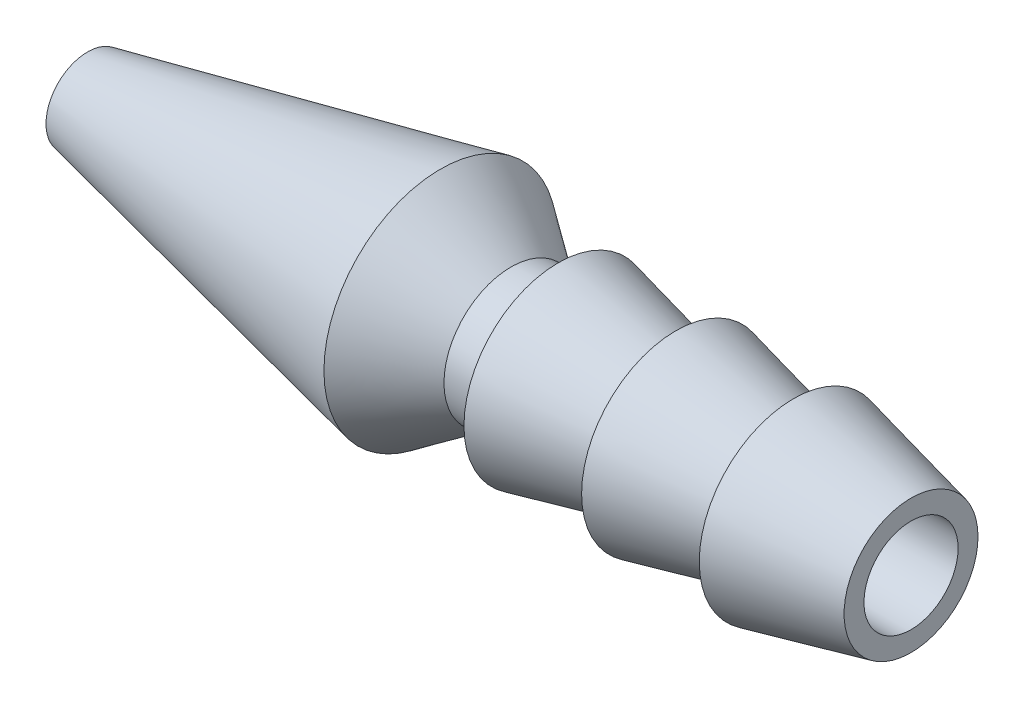
ISO-10303-21;
HEADER;
FILE_DESCRIPTION(('STEP AP214'),'2;1');
FILE_NAME('part.step','',(''),(''),'','','');
FILE_SCHEMA(('AUTOMOTIVE_DESIGN { 1 0 10303 214 1 1 1 1 }'));
ENDSEC;
DATA;
#1=APPLICATION_CONTEXT('core data for automotive mechanical design processes');
#2=APPLICATION_PROTOCOL_DEFINITION('international standard','automotive_design',2000,#1);
#3=PRODUCT_CONTEXT('',#1,'mechanical');
#4=PRODUCT('Part','Part','',(#3));
#5=PRODUCT_RELATED_PRODUCT_CATEGORY('part','',(#4));
#6=PRODUCT_DEFINITION_FORMATION('','',#4);
#7=PRODUCT_DEFINITION_CONTEXT('part definition',#1,'design');
#8=PRODUCT_DEFINITION('design','',#6,#7);
#9=PRODUCT_DEFINITION_SHAPE('','',#8);
#10=(LENGTH_UNIT() NAMED_UNIT(*) SI_UNIT(.MILLI.,.METRE.));
#11=(NAMED_UNIT(*) PLANE_ANGLE_UNIT() SI_UNIT($,.RADIAN.));
#12=(NAMED_UNIT(*) SI_UNIT($,.STERADIAN.) SOLID_ANGLE_UNIT());
#13=UNCERTAINTY_MEASURE_WITH_UNIT(LENGTH_MEASURE(1.E-05),#10,'distance_accuracy_value','');
#14=(GEOMETRIC_REPRESENTATION_CONTEXT(3) GLOBAL_UNCERTAINTY_ASSIGNED_CONTEXT((#13)) GLOBAL_UNIT_ASSIGNED_CONTEXT((#10,
#11,#12)) REPRESENTATION_CONTEXT('',''));
#15=CARTESIAN_POINT('',(0.,0.,0.));
#16=DIRECTION('',(0.,0.,1.));
#17=DIRECTION('',(1.,0.,0.));
#18=AXIS2_PLACEMENT_3D('',#15,#16,#17);
#19=CARTESIAN_POINT('',(0.,0.,0.));
#20=DIRECTION('',(-1.,0.,0.));
#21=DIRECTION('',(0.,0.,-1.));
#22=AXIS2_PLACEMENT_3D('',#19,#20,#21);
#23=CONICAL_SURFACE('',#22,4.,0.226892802759263);
#24=CARTESIAN_POINT('',(5.,0.,0.));
#25=DIRECTION('',(1.,0.,0.));
#26=DIRECTION('',(0.,0.,-1.));
#27=AXIS2_PLACEMENT_3D('',#24,#25,#26);
#28=CIRCLE('',#27,2.84565904437218);
#29=CARTESIAN_POINT('',(5.,0.,-2.84565904437218));
#30=VERTEX_POINT('',#29);
#31=EDGE_CURVE('E36',#30,#30,#28,.T.);
#32=ORIENTED_EDGE('',*,*,#31,.F.);
#33=EDGE_LOOP('',(#32));
#34=FACE_BOUND('',#33,.T.);
#35=CARTESIAN_POINT('',(0.,0.,0.));
#36=DIRECTION('',(1.,0.,0.));
#37=DIRECTION('',(0.,0.,-1.));
#38=AXIS2_PLACEMENT_3D('',#35,#36,#37);
#39=CIRCLE('',#38,4.);
#40=CARTESIAN_POINT('',(0.,0.,-4.));
#41=VERTEX_POINT('',#40);
#42=EDGE_CURVE('E44',#41,#41,#39,.T.);
#43=ORIENTED_EDGE('',*,*,#42,.T.);
#44=EDGE_LOOP('',(#43));
#45=FACE_BOUND('',#44,.T.);
#46=ADVANCED_FACE('F33',(#34,#45),#23,.T.);
#47=CARTESIAN_POINT('',(0.,0.,0.));
#48=DIRECTION('',(1.,0.,0.));
#49=DIRECTION('',(0.,0.,-1.));
#50=AXIS2_PLACEMENT_3D('',#47,#48,#49);
#51=PLANE('',#50);
#52=CARTESIAN_POINT('',(0.,0.,0.));
#53=DIRECTION('',(-1.,0.,0.));
#54=DIRECTION('',(0.,0.,1.));
#55=AXIS2_PLACEMENT_3D('',#52,#53,#54);
#56=CIRCLE('',#55,2.85);
#57=CARTESIAN_POINT('',(0.,0.,2.85));
#58=VERTEX_POINT('',#57);
#59=EDGE_CURVE('E10',#58,#58,#56,.T.);
#60=ORIENTED_EDGE('',*,*,#59,.F.);
#61=EDGE_LOOP('',(#60));
#62=FACE_BOUND('',#61,.T.);
#63=ORIENTED_EDGE('',*,*,#42,.F.);
#64=EDGE_LOOP('',(#63));
#65=FACE_BOUND('',#64,.T.);
#66=ADVANCED_FACE('F64',(#62,#65),#51,.F.);
#67=CARTESIAN_POINT('',(5.,0.,0.));
#68=DIRECTION('',(-1.,0.,0.));
#69=DIRECTION('',(0.,0.,-1.));
#70=AXIS2_PLACEMENT_3D('',#67,#68,#69);
#71=CONICAL_SURFACE('',#70,4.,0.226892802759263);
#72=CARTESIAN_POINT('',(10.,0.,0.));
#73=DIRECTION('',(1.,0.,0.));
#74=DIRECTION('',(0.,0.,-1.));
#75=AXIS2_PLACEMENT_3D('',#72,#73,#74);
#76=CIRCLE('',#75,2.84565904437218);
#77=CARTESIAN_POINT('',(10.,0.,-2.84565904437218));
#78=VERTEX_POINT('',#77);
#79=EDGE_CURVE('E58',#78,#78,#76,.T.);
#80=ORIENTED_EDGE('',*,*,#79,.F.);
#81=EDGE_LOOP('',(#80));
#82=FACE_BOUND('',#81,.T.);
#83=CARTESIAN_POINT('',(5.,0.,0.));
#84=DIRECTION('',(1.,0.,0.));
#85=DIRECTION('',(0.,0.,-1.));
#86=AXIS2_PLACEMENT_3D('',#83,#84,#85);
#87=CIRCLE('',#86,4.);
#88=CARTESIAN_POINT('',(5.,0.,-4.));
#89=VERTEX_POINT('',#88);
#90=EDGE_CURVE('E55',#89,#89,#87,.T.);
#91=ORIENTED_EDGE('',*,*,#90,.T.);
#92=EDGE_LOOP('',(#91));
#93=FACE_BOUND('',#92,.T.);
#94=ADVANCED_FACE('F66',(#82,#93),#71,.T.);
#95=CARTESIAN_POINT('',(5.,0.,0.));
#96=DIRECTION('',(1.,0.,0.));
#97=DIRECTION('',(0.,0.,-1.));
#98=AXIS2_PLACEMENT_3D('',#95,#96,#97);
#99=PLANE('',#98);
#100=ORIENTED_EDGE('',*,*,#31,.T.);
#101=EDGE_LOOP('',(#100));
#102=FACE_BOUND('',#101,.T.);
#103=ORIENTED_EDGE('',*,*,#90,.F.);
#104=EDGE_LOOP('',(#103));
#105=FACE_BOUND('',#104,.T.);
#106=ADVANCED_FACE('F72',(#102,#105),#99,.F.);
#107=CARTESIAN_POINT('',(10.,0.,0.));
#108=DIRECTION('',(-1.,0.,0.));
#109=DIRECTION('',(0.,0.,-1.));
#110=AXIS2_PLACEMENT_3D('',#107,#108,#109);
#111=CONICAL_SURFACE('',#110,4.,0.226892802759263);
#112=CARTESIAN_POINT('',(15.,0.,0.));
#113=DIRECTION('',(1.,0.,0.));
#114=DIRECTION('',(0.,0.,-1.));
#115=AXIS2_PLACEMENT_3D('',#112,#113,#114);
#116=CIRCLE('',#115,2.84565904437218);
#117=CARTESIAN_POINT('',(15.,0.,-2.84565904437218));
#118=VERTEX_POINT('',#117);
#119=EDGE_CURVE('E52',#118,#118,#116,.T.);
#120=ORIENTED_EDGE('',*,*,#119,.F.);
#121=EDGE_LOOP('',(#120));
#122=FACE_BOUND('',#121,.T.);
#123=CARTESIAN_POINT('',(10.,0.,0.));
#124=DIRECTION('',(1.,0.,0.));
#125=DIRECTION('',(0.,0.,-1.));
#126=AXIS2_PLACEMENT_3D('',#123,#124,#125);
#127=CIRCLE('',#126,4.);
#128=CARTESIAN_POINT('',(10.,0.,-4.));
#129=VERTEX_POINT('',#128);
#130=EDGE_CURVE('E49',#129,#129,#127,.T.);
#131=ORIENTED_EDGE('',*,*,#130,.T.);
#132=EDGE_LOOP('',(#131));
#133=FACE_BOUND('',#132,.T.);
#134=ADVANCED_FACE('F79',(#122,#133),#111,.T.);
#135=CARTESIAN_POINT('',(15.,0.,0.));
#136=DIRECTION('',(1.,0.,0.));
#137=DIRECTION('',(0.,0.,-1.));
#138=AXIS2_PLACEMENT_3D('',#135,#136,#137);
#139=PLANE('',#138);
#140=CARTESIAN_POINT('',(15.,0.,0.));
#141=DIRECTION('',(1.,0.,0.));
#142=DIRECTION('',(0.,0.,-1.));
#143=AXIS2_PLACEMENT_3D('',#140,#141,#142);
#144=CIRCLE('',#143,2.);
#145=CARTESIAN_POINT('',(15.,0.,-2.));
#146=VERTEX_POINT('',#145);
#147=EDGE_CURVE('E128',#146,#146,#144,.T.);
#148=ORIENTED_EDGE('',*,*,#147,.F.);
#149=EDGE_LOOP('',(#148));
#150=FACE_BOUND('',#149,.T.);
#151=ORIENTED_EDGE('',*,*,#119,.T.);
#152=EDGE_LOOP('',(#151));
#153=FACE_BOUND('',#152,.T.);
#154=ADVANCED_FACE('F83',(#150,#153),#139,.T.);
#155=CARTESIAN_POINT('',(10.,0.,0.));
#156=DIRECTION('',(1.,0.,0.));
#157=DIRECTION('',(0.,0.,-1.));
#158=AXIS2_PLACEMENT_3D('',#155,#156,#157);
#159=PLANE('',#158);
#160=ORIENTED_EDGE('',*,*,#79,.T.);
#161=EDGE_LOOP('',(#160));
#162=FACE_BOUND('',#161,.T.);
#163=ORIENTED_EDGE('',*,*,#130,.F.);
#164=EDGE_LOOP('',(#163));
#165=FACE_BOUND('',#164,.T.);
#166=ADVANCED_FACE('F85',(#162,#165),#159,.F.);
#167=CARTESIAN_POINT('',(-2.,0.,0.));
#168=DIRECTION('',(1.,0.,0.));
#169=DIRECTION('',(0.,0.,-1.));
#170=AXIS2_PLACEMENT_3D('',#167,#168,#169);
#171=CYLINDRICAL_SURFACE('',#170,2.85);
#172=CARTESIAN_POINT('',(-2.,0.,0.));
#173=DIRECTION('',(-1.,0.,0.));
#174=DIRECTION('',(0.,0.,1.));
#175=AXIS2_PLACEMENT_3D('',#172,#173,#174);
#176=CIRCLE('',#175,2.85);
#177=CARTESIAN_POINT('',(-2.,0.,2.85));
#178=VERTEX_POINT('',#177);
#179=EDGE_CURVE('E47',#178,#178,#176,.T.);
#180=ORIENTED_EDGE('',*,*,#179,.F.);
#181=EDGE_LOOP('',(#180));
#182=FACE_BOUND('',#181,.T.);
#183=ORIENTED_EDGE('',*,*,#59,.T.);
#184=EDGE_LOOP('',(#183));
#185=FACE_BOUND('',#184,.T.);
#186=ADVANCED_FACE('F88',(#182,#185),#171,.T.);
#187=CARTESIAN_POINT('',(-2.,0.,0.));
#188=DIRECTION('',(-1.,0.,0.));
#189=DIRECTION('',(0.,0.,1.));
#190=AXIS2_PLACEMENT_3D('',#187,#188,#189);
#191=CONICAL_SURFACE('',#190,2.85,0.610865238198016);
#192=CARTESIAN_POINT('',(-5.,0.,0.));
#193=DIRECTION('',(-1.,0.,0.));
#194=DIRECTION('',(0.,0.,1.));
#195=AXIS2_PLACEMENT_3D('',#192,#193,#194);
#196=CIRCLE('',#195,4.95062261462913);
#197=CARTESIAN_POINT('',(-5.,0.,4.95062261462913));
#198=VERTEX_POINT('',#197);
#199=EDGE_CURVE('E138',#198,#198,#196,.T.);
#200=ORIENTED_EDGE('',*,*,#199,.F.);
#201=EDGE_LOOP('',(#200));
#202=FACE_BOUND('',#201,.T.);
#203=ORIENTED_EDGE('',*,*,#179,.T.);
#204=EDGE_LOOP('',(#203));
#205=FACE_BOUND('',#204,.T.);
#206=ADVANCED_FACE('F95',(#202,#205),#191,.T.);
#207=CARTESIAN_POINT('',(-5.,0.,0.));
#208=DIRECTION('',(1.,0.,0.));
#209=DIRECTION('',(0.,0.,1.));
#210=AXIS2_PLACEMENT_3D('',#207,#208,#209);
#211=CONICAL_SURFACE('',#210,4.95062261462913,0.20943951023932);
#212=CARTESIAN_POINT('',(-20.,0.,0.));
#213=DIRECTION('',(-1.,0.,0.));
#214=DIRECTION('',(0.,0.,1.));
#215=AXIS2_PLACEMENT_3D('',#212,#213,#214);
#216=CIRCLE('',#215,1.7622741895788);
#217=CARTESIAN_POINT('',(-20.,0.,1.7622741895788));
#218=VERTEX_POINT('',#217);
#219=EDGE_CURVE('E131',#218,#218,#216,.T.);
#220=ORIENTED_EDGE('',*,*,#219,.F.);
#221=EDGE_LOOP('',(#220));
#222=FACE_BOUND('',#221,.T.);
#223=ORIENTED_EDGE('',*,*,#199,.T.);
#224=EDGE_LOOP('',(#223));
#225=FACE_BOUND('',#224,.T.);
#226=ADVANCED_FACE('F99',(#222,#225),#211,.T.);
#227=CARTESIAN_POINT('',(-20.,0.,0.));
#228=DIRECTION('',(-1.,0.,0.));
#229=DIRECTION('',(0.,0.,1.));
#230=AXIS2_PLACEMENT_3D('',#227,#228,#229);
#231=PLANE('',#230);
#232=CARTESIAN_POINT('',(-20.,0.,0.));
#233=DIRECTION('',(-1.,0.,0.));
#234=DIRECTION('',(0.,0.,1.));
#235=AXIS2_PLACEMENT_3D('',#232,#233,#234);
#236=CIRCLE('',#235,0.5);
#237=CARTESIAN_POINT('',(-20.,0.,0.5));
#238=VERTEX_POINT('',#237);
#239=EDGE_CURVE('E133',#238,#238,#236,.T.);
#240=ORIENTED_EDGE('',*,*,#239,.F.);
#241=EDGE_LOOP('',(#240));
#242=FACE_BOUND('',#241,.T.);
#243=ORIENTED_EDGE('',*,*,#219,.T.);
#244=EDGE_LOOP('',(#243));
#245=FACE_BOUND('',#244,.T.);
#246=ADVANCED_FACE('F103',(#242,#245),#231,.T.);
#247=CARTESIAN_POINT('',(-5.,0.,0.));
#248=DIRECTION('',(1.,0.,0.));
#249=DIRECTION('',(0.,0.,-1.));
#250=AXIS2_PLACEMENT_3D('',#247,#248,#249);
#251=CYLINDRICAL_SURFACE('',#250,2.);
#252=CARTESIAN_POINT('',(-5.,0.,0.));
#253=DIRECTION('',(1.,0.,0.));
#254=DIRECTION('',(0.,0.,-1.));
#255=AXIS2_PLACEMENT_3D('',#252,#253,#254);
#256=CIRCLE('',#255,2.);
#257=CARTESIAN_POINT('',(-5.,0.,-2.));
#258=VERTEX_POINT('',#257);
#259=EDGE_CURVE('E127',#258,#258,#256,.T.);
#260=ORIENTED_EDGE('',*,*,#259,.F.);
#261=EDGE_LOOP('',(#260));
#262=FACE_BOUND('',#261,.T.);
#263=ORIENTED_EDGE('',*,*,#147,.T.);
#264=EDGE_LOOP('',(#263));
#265=FACE_BOUND('',#264,.T.);
#266=ADVANCED_FACE('F107',(#262,#265),#251,.F.);
#267=CARTESIAN_POINT('',(-5.,0.,0.));
#268=DIRECTION('',(-1.,0.,0.));
#269=DIRECTION('',(0.,0.,1.));
#270=AXIS2_PLACEMENT_3D('',#267,#268,#269);
#271=PLANE('',#270);
#272=CARTESIAN_POINT('',(-5.,0.,0.));
#273=DIRECTION('',(-1.,0.,0.));
#274=DIRECTION('',(0.,0.,1.));
#275=AXIS2_PLACEMENT_3D('',#272,#273,#274);
#276=CIRCLE('',#275,2.02364443725993);
#277=CARTESIAN_POINT('',(-5.,0.,2.02364443725993));
#278=VERTEX_POINT('',#277);
#279=EDGE_CURVE('E124',#278,#278,#276,.T.);
#280=ORIENTED_EDGE('',*,*,#279,.T.);
#281=EDGE_LOOP('',(#280));
#282=FACE_BOUND('',#281,.T.);
#283=ORIENTED_EDGE('',*,*,#259,.T.);
#284=EDGE_LOOP('',(#283));
#285=FACE_BOUND('',#284,.T.);
#286=ADVANCED_FACE('F111',(#282,#285),#271,.T.);
#287=CARTESIAN_POINT('',(-20.,0.,0.));
#288=DIRECTION('',(1.,0.,0.));
#289=DIRECTION('',(0.,0.,1.));
#290=AXIS2_PLACEMENT_3D('',#287,#288,#289);
#291=CONICAL_SURFACE('',#290,0.5,0.101229096615671);
#292=CARTESIAN_POINT('',(-5.,0.,2.02364443725993));
#293=CARTESIAN_POINT('',(-5.15625,0.,2.00777314103847));
#294=CARTESIAN_POINT('',(-5.3125,0.,1.99190184481701));
#295=CARTESIAN_POINT('',(-5.625,0.,1.9601592523741));
#296=CARTESIAN_POINT('',(-5.78125,0.,1.94428795615264));
#297=CARTESIAN_POINT('',(-6.09375,0.,1.91254536370973));
#298=CARTESIAN_POINT('',(-6.25,0.,1.89667406748827));
#299=CARTESIAN_POINT('',(-6.5625,0.,1.86493147504535));
#300=CARTESIAN_POINT('',(-6.71875,0.,1.8490601788239));
#301=CARTESIAN_POINT('',(-7.03125,0.,1.81731758638098));
#302=CARTESIAN_POINT('',(-7.1875,0.,1.80144629015952));
#303=CARTESIAN_POINT('',(-7.5,0.,1.76970369771661));
#304=CARTESIAN_POINT('',(-7.65625,0.,1.75383240149515));
#305=CARTESIAN_POINT('',(-7.96875,0.,1.72208980905223));
#306=CARTESIAN_POINT('',(-8.125,0.,1.70621851283078));
#307=CARTESIAN_POINT('',(-8.4375,0.,1.67447592038786));
#308=CARTESIAN_POINT('',(-8.59375,0.,1.6586046241664));
#309=CARTESIAN_POINT('',(-8.90625,0.,1.62686203172349));
#310=CARTESIAN_POINT('',(-9.0625,0.,1.61099073550203));
#311=CARTESIAN_POINT('',(-9.375,0.,1.57924814305912));
#312=CARTESIAN_POINT('',(-9.53125,0.,1.56337684683766));
#313=CARTESIAN_POINT('',(-9.84375,0.,1.53163425439474));
#314=CARTESIAN_POINT('',(-10.,0.,1.51576295817329));
#315=CARTESIAN_POINT('',(-10.3125,0.,1.48402036573037));
#316=CARTESIAN_POINT('',(-10.46875,0.,1.46814906950891));
#317=CARTESIAN_POINT('',(-10.78125,0.,1.436406477066));
#318=CARTESIAN_POINT('',(-10.9375,0.,1.42053518084454));
#319=CARTESIAN_POINT('',(-11.25,0.,1.38879258840163));
#320=CARTESIAN_POINT('',(-11.40625,0.,1.37292129218017));
#321=CARTESIAN_POINT('',(-11.71875,0.,1.34117869973725));
#322=CARTESIAN_POINT('',(-11.875,0.,1.3253074035158));
#323=CARTESIAN_POINT('',(-12.1875,0.,1.29356481107288));
#324=CARTESIAN_POINT('',(-12.34375,0.,1.27769351485142));
#325=CARTESIAN_POINT('',(-12.65625,0.,1.24595092240851));
#326=CARTESIAN_POINT('',(-12.8125,0.,1.23007962618705));
#327=CARTESIAN_POINT('',(-13.125,0.,1.19833703374413));
#328=CARTESIAN_POINT('',(-13.28125,0.,1.18246573752268));
#329=CARTESIAN_POINT('',(-13.59375,0.,1.15072314507976));
#330=CARTESIAN_POINT('',(-13.75,0.,1.1348518488583));
#331=CARTESIAN_POINT('',(-14.0625,0.,1.10310925641539));
#332=CARTESIAN_POINT('',(-14.21875,0.,1.08723796019393));
#333=CARTESIAN_POINT('',(-14.53125,0.,1.05549536775102));
#334=CARTESIAN_POINT('',(-14.6875,0.,1.03962407152956));
#335=CARTESIAN_POINT('',(-15.,0.,1.00788147908664));
#336=CARTESIAN_POINT('',(-15.15625,0.,0.992010182865186));
#337=CARTESIAN_POINT('',(-15.46875,0.,0.96026759042227));
#338=CARTESIAN_POINT('',(-15.625,0.,0.944396294200813));
#339=CARTESIAN_POINT('',(-15.9375,0.,0.912653701757898));
#340=CARTESIAN_POINT('',(-16.09375,0.,0.89678240553644));
#341=CARTESIAN_POINT('',(-16.40625,0.,0.865039813093525));
#342=CARTESIAN_POINT('',(-16.5625,0.,0.849168516872067));
#343=CARTESIAN_POINT('',(-16.875,0.,0.817425924429152));
#344=CARTESIAN_POINT('',(-17.03125,0.,0.801554628207694));
#345=CARTESIAN_POINT('',(-17.34375,0.,0.769812035764779));
#346=CARTESIAN_POINT('',(-17.5,0.,0.753940739543322));
#347=CARTESIAN_POINT('',(-17.8125,0.,0.722198147100406));
#348=CARTESIAN_POINT('',(-17.96875,0.,0.706326850878949));
#349=CARTESIAN_POINT('',(-18.28125,0.,0.674584258436034));
#350=CARTESIAN_POINT('',(-18.4375,0.,0.658712962214576));
#351=CARTESIAN_POINT('',(-18.75,0.,0.626970369771661));
#352=CARTESIAN_POINT('',(-18.90625,0.,0.611099073550203));
#353=CARTESIAN_POINT('',(-19.21875,0.,0.579356481107288));
#354=CARTESIAN_POINT('',(-19.375,0.,0.563485184885831));
#355=CARTESIAN_POINT('',(-19.6875,0.,0.531742592442916));
#356=CARTESIAN_POINT('',(-19.84375,0.,0.515871296221458));
#357=CARTESIAN_POINT('',(-20.,0.,0.5));
#358=B_SPLINE_CURVE_WITH_KNOTS('',3,(#292,#293,#294,#295,#296,#297,#298,#299,#300,#301,#302,
#303,#304,#305,#306,#307,#308,#309,#310,#311,#312,#313,#314,#315,#316,#317,#318,#319,#320,#321,
#322,#323,#324,#325,#326,#327,#328,#329,#330,#331,#332,#333,#334,#335,#336,#337,#338,#339,#340,
#341,#342,#343,#344,#345,#346,#347,#348,#349,#350,#351,#352,#353,#354,#355,#356,#357),
.UNSPECIFIED.,.F.,.F.,(4,2,2,2,2,2,2,2,2,2,2,2,2,2,2,2,2,2,2,2,2,2,2,2,2,2,2,2,2,2,2,2,4),(0.,
0.471162015546398,0.942324031092793,1.41348604663919,1.88464806218559,2.35581007773198,
2.82697209327838,3.29813410882478,3.76929612437118,4.24045813991757,4.71162015546397,
5.18278217101037,5.65394418655676,6.12510620210316,6.59626821764956,7.06743023319595,
7.53859224874235,8.00975426428875,8.48091627983514,8.95207829538154,9.42324031092794,
9.89440232647434,10.3655643420207,10.8367263575671,11.3078883731135,11.7790503886599,
12.2502124042063,12.7213744197527,13.1925364352991,13.6636984508455,14.1348604663919,
14.6060224819383,15.0771844974847),.UNSPECIFIED.);
#359=EDGE_CURVE('BSEAM113',#278,#238,#358,.T.);
#360=ORIENTED_EDGE('',*,*,#279,.F.);
#361=ORIENTED_EDGE('',*,*,#239,.T.);
#362=ORIENTED_EDGE('',*,*,#359,.T.);
#363=ORIENTED_EDGE('',*,*,#359,.F.);
#364=EDGE_LOOP('',(#360,#362,#361,#363));
#365=FACE_BOUND('',#364,.T.);
#366=ADVANCED_FACE('F113',(#365),#291,.F.);
#367=CLOSED_SHELL('',(#46,#66,#94,#106,#134,#154,#166,#186,#206,#226,#246,#266,#286,#366));
#368=MANIFOLD_SOLID_BREP('B2',#367);
#369=ADVANCED_BREP_SHAPE_REPRESENTATION('',(#18,#368),#14);
#370=SHAPE_DEFINITION_REPRESENTATION(#9,#369);
ENDSEC;
END-ISO-10303-21;
